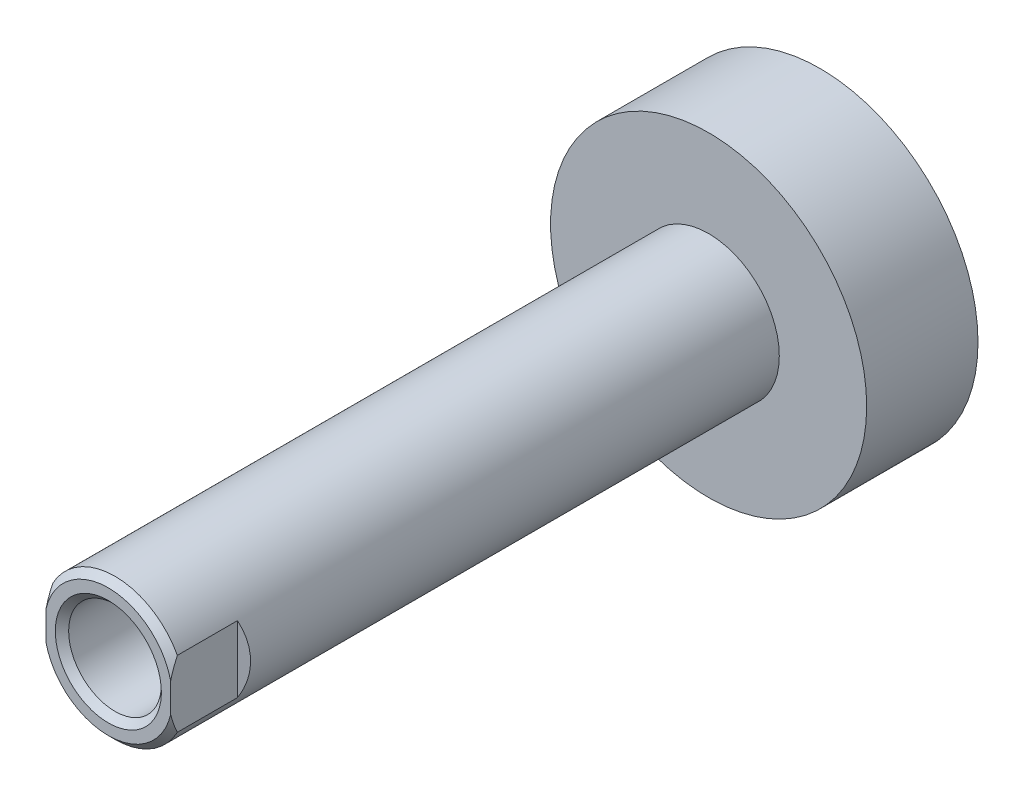
ISO-10303-21;
HEADER;
FILE_DESCRIPTION(('STEP AP214'),'2;1');
FILE_NAME('part.step','',(''),(''),'','','');
FILE_SCHEMA(('AUTOMOTIVE_DESIGN { 1 0 10303 214 1 1 1 1 }'));
ENDSEC;
DATA;
#1=APPLICATION_CONTEXT('core data for automotive mechanical design processes');
#2=APPLICATION_PROTOCOL_DEFINITION('international standard','automotive_design',2000,#1);
#3=PRODUCT_CONTEXT('',#1,'mechanical');
#4=PRODUCT('Part','Part','',(#3));
#5=PRODUCT_RELATED_PRODUCT_CATEGORY('part','',(#4));
#6=PRODUCT_DEFINITION_FORMATION('','',#4);
#7=PRODUCT_DEFINITION_CONTEXT('part definition',#1,'design');
#8=PRODUCT_DEFINITION('design','',#6,#7);
#9=PRODUCT_DEFINITION_SHAPE('','',#8);
#10=(LENGTH_UNIT() NAMED_UNIT(*) SI_UNIT(.MILLI.,.METRE.));
#11=(NAMED_UNIT(*) PLANE_ANGLE_UNIT() SI_UNIT($,.RADIAN.));
#12=(NAMED_UNIT(*) SI_UNIT($,.STERADIAN.) SOLID_ANGLE_UNIT());
#13=UNCERTAINTY_MEASURE_WITH_UNIT(LENGTH_MEASURE(1.E-05),#10,'distance_accuracy_value','');
#14=(GEOMETRIC_REPRESENTATION_CONTEXT(3) GLOBAL_UNCERTAINTY_ASSIGNED_CONTEXT((#13)) GLOBAL_UNIT_ASSIGNED_CONTEXT((#10,
#11,#12)) REPRESENTATION_CONTEXT('',''));
#15=CARTESIAN_POINT('',(0.,0.,0.));
#16=DIRECTION('',(0.,0.,1.));
#17=DIRECTION('',(1.,0.,0.));
#18=AXIS2_PLACEMENT_3D('',#15,#16,#17);
#19=CARTESIAN_POINT('',(0.,0.,31.964));
#20=DIRECTION('',(0.,0.,-1.));
#21=DIRECTION('',(-1.,0.,0.));
#22=AXIS2_PLACEMENT_3D('',#19,#20,#21);
#23=CONICAL_SURFACE('',#22,2.875,0.785398163397448);
#24=CARTESIAN_POINT('',(2.8,6.40409288585039,27.8495504014551));
#25=CARTESIAN_POINT('',(2.8,6.21530131402021,28.0224791142946));
#26=CARTESIAN_POINT('',(2.8,6.02594277949216,28.1947983655281));
#27=CARTESIAN_POINT('',(2.8,5.64560917698831,28.5377342817093));
#28=CARTESIAN_POINT('',(2.8,5.45463373183104,28.7083505279696));
#29=CARTESIAN_POINT('',(2.8,5.0693993005037,29.048438486706));
#30=CARTESIAN_POINT('',(2.8,4.87512693210801,29.2178950791546));
#31=CARTESIAN_POINT('',(2.8,4.48388823614274,29.5536313887583));
#32=CARTESIAN_POINT('',(2.8,4.28692225071637,29.7199115030752));
#33=CARTESIAN_POINT('',(2.8,3.92252866507082,30.020547193242));
#34=CARTESIAN_POINT('',(2.8,3.75567079567851,30.1555906179416));
#35=CARTESIAN_POINT('',(2.8,3.41848834775858,30.4213896916908));
#36=CARTESIAN_POINT('',(2.8,3.24816284560577,30.5521441734836));
#37=CARTESIAN_POINT('',(2.8,2.90310026082266,30.8073200193591));
#38=CARTESIAN_POINT('',(2.8,2.72836898816859,30.9317491319853));
#39=CARTESIAN_POINT('',(2.8,2.4615936005942,31.1113775075954));
#40=CARTESIAN_POINT('',(2.8,2.37190693686159,31.1700734947239));
#41=CARTESIAN_POINT('',(2.8,2.19069178803806,31.2845403791412));
#42=CARTESIAN_POINT('',(2.8,2.09916353869149,31.3403116475729));
#43=CARTESIAN_POINT('',(2.8,1.91535619256875,31.4473786837928));
#44=CARTESIAN_POINT('',(2.8,1.82310918445457,31.4987292209963));
#45=CARTESIAN_POINT('',(2.8,1.63626007281443,31.5969280610082));
#46=CARTESIAN_POINT('',(2.8,1.54165859274648,31.6437775400462));
#47=CARTESIAN_POINT('',(2.8,1.3499249148038,31.7317423789926));
#48=CARTESIAN_POINT('',(2.8,1.25279557260696,31.7728639021425));
#49=CARTESIAN_POINT('',(2.8,1.05579132027356,31.847944220849));
#50=CARTESIAN_POINT('',(2.8,0.955917202290766,31.8819050589735));
#51=CARTESIAN_POINT('',(2.8,0.774015610001952,31.9350128160452));
#52=CARTESIAN_POINT('',(2.8,0.692459969683759,31.955766485837));
#53=CARTESIAN_POINT('',(2.8,0.527974791108692,31.9907885828827));
#54=CARTESIAN_POINT('',(2.8,0.445045717822624,32.0050591602577));
#55=CARTESIAN_POINT('',(2.8,0.278459436251544,32.0263967953165));
#56=CARTESIAN_POINT('',(2.8,0.194804513514812,32.0334814400774));
#57=CARTESIAN_POINT('',(2.8,0.0271926983588117,32.0401200407255));
#58=CARTESIAN_POINT('',(2.8,-0.0567641889013517,32.039674124668));
#59=CARTESIAN_POINT('',(2.8,-0.224256787385993,32.0312791669753));
#60=CARTESIAN_POINT('',(2.8,-0.307792675605983,32.0233335991373));
#61=CARTESIAN_POINT('',(2.8,-0.473890294720242,32.0003734951748));
#62=CARTESIAN_POINT('',(2.8,-0.556451813717606,31.9853574494422));
#63=CARTESIAN_POINT('',(2.8,-0.720378465833255,31.9489246360367));
#64=CARTESIAN_POINT('',(2.8,-0.801739522303185,31.927489762131));
#65=CARTESIAN_POINT('',(2.8,-0.962778849550983,31.8790943027323));
#66=CARTESIAN_POINT('',(2.8,-1.04245714605219,31.8521338017738));
#67=CARTESIAN_POINT('',(2.8,-1.21987368113352,31.7861807538754));
#68=CARTESIAN_POINT('',(2.8,-1.31711815376234,31.7458671833215));
#69=CARTESIAN_POINT('',(2.8,-1.50900170685828,31.6594178174973));
#70=CARTESIAN_POINT('',(2.8,-1.6036395501869,31.6132793137298));
#71=CARTESIAN_POINT('',(2.8,-1.79068294250203,31.5163296497851));
#72=CARTESIAN_POINT('',(2.8,-1.88308428843925,31.4655104419594));
#73=CARTESIAN_POINT('',(2.8,-2.06579163515272,31.3602183243824));
#74=CARTESIAN_POINT('',(2.8,-2.15609721381246,31.3057446870287));
#75=CARTESIAN_POINT('',(2.8,-2.33581888189106,31.1933062497769));
#76=CARTESIAN_POINT('',(2.8,-2.4252157445204,31.1353108566371));
#77=CARTESIAN_POINT('',(2.8,-2.60241554860158,31.0169282900505));
#78=CARTESIAN_POINT('',(2.8,-2.69021835064665,30.9565409088705));
#79=CARTESIAN_POINT('',(2.8,-2.95163931230509,30.7724562849016));
#80=CARTESIAN_POINT('',(2.8,-3.1232209180828,30.6458679924581));
#81=CARTESIAN_POINT('',(2.8,-3.43143863596192,30.4110457530675));
#82=CARTESIAN_POINT('',(2.8,-3.5687407975733,30.3036750622679));
#83=CARTESIAN_POINT('',(2.8,-3.84120420423013,30.0863065843494));
#84=CARTESIAN_POINT('',(2.8,-3.97636586386933,29.9763093165843));
#85=CARTESIAN_POINT('',(2.8,-4.24509543339167,29.7542072896423));
#86=CARTESIAN_POINT('',(2.8,-4.3786621976108,29.6421011488779));
#87=CARTESIAN_POINT('',(2.8,-4.64443688882979,29.4162794076186));
#88=CARTESIAN_POINT('',(2.8,-4.77664474964281,29.3025637293647));
#89=CARTESIAN_POINT('',(2.8,-5.16103062136353,28.9686969018967));
#90=CARTESIAN_POINT('',(2.8,-5.41172447055858,28.7468373546205));
#91=CARTESIAN_POINT('',(2.8,-5.78548758602014,28.4118019699764));
#92=CARTESIAN_POINT('',(2.8,-5.90962703562807,28.2998122892259));
#93=CARTESIAN_POINT('',(2.8,-6.15729395528682,28.0751586496859));
#94=CARTESIAN_POINT('',(2.8,-6.28082142680382,27.9624946925134));
#95=CARTESIAN_POINT('',(2.8,-6.40409288585039,27.8495504014551));
#96=B_SPLINE_CURVE_WITH_KNOTS('',3,(#24,#25,#26,#27,#28,#29,#30,#31,#32,#33,#34,#35,#36,#37,#38,
#39,#40,#41,#42,#43,#44,#45,#46,#47,#48,#49,#50,#51,#52,#53,#54,#55,#56,#57,#58,#59,#60,#61,#62,
#63,#64,#65,#66,#67,#68,#69,#70,#71,#72,#73,#74,#75,#76,#77,#78,#79,#80,#81,#82,#83,#84,#85,#86,
#87,#88,#89,#90,#91,#92,#93,#94,#95),.UNSPECIFIED.,.F.,.F.,(4,2,2,2,2,2,2,2,2,2,2,2,2,2,2,2,2,2,
2,2,2,2,2,2,2,2,2,2,2,2,2,2,2,2,2,4),(0.,0.7680704659828,1.5363253295418,2.3096809370453,
3.0829392088611,3.72686189949447,4.37095840685427,5.01424588420806,5.33576238949959,
5.65723799555328,5.973870166396,6.29041936764635,6.60662528866311,6.92274089032019,
7.17497877598579,7.4271329456448,7.67866848525016,7.93019974755984,8.1816145591257,
8.43308307428408,8.68526772293322,8.93744851379238,9.25300704333973,9.56871284654273,
9.88497196065972,10.2012942304021,10.5209300388869,10.840593667401,11.4800956660014,
12.0029633797013,12.5257285490225,13.0488490267357,13.571994863987,14.5762479594562,
15.0778149878801,15.5793808140611),.UNSPECIFIED.);
#97=CARTESIAN_POINT('',(2.8,1.49687173799227,31.664));
#98=VERTEX_POINT('',#97);
#99=CARTESIAN_POINT('',(2.8,0.652399417534977,31.964));
#100=VERTEX_POINT('',#99);
#101=EDGE_CURVE('E43',#98,#100,#96,.T.);
#102=ORIENTED_EDGE('',*,*,#101,.F.);
#103=CARTESIAN_POINT('',(0.,0.,31.664));
#104=DIRECTION('',(0.,0.,-1.));
#105=DIRECTION('',(-1.,0.,0.));
#106=AXIS2_PLACEMENT_3D('',#103,#104,#105);
#107=CIRCLE('',#106,3.175);
#108=CARTESIAN_POINT('',(-2.8,1.49687173799227,31.664));
#109=VERTEX_POINT('',#108);
#110=EDGE_CURVE('E115',#109,#98,#107,.T.);
#111=ORIENTED_EDGE('',*,*,#110,.F.);
#112=CARTESIAN_POINT('',(-2.8,-6.40409288585039,27.8495504014551));
#113=CARTESIAN_POINT('',(-2.8,-6.21530131402021,28.0224791142946));
#114=CARTESIAN_POINT('',(-2.8,-6.02594277949216,28.1947983655281));
#115=CARTESIAN_POINT('',(-2.8,-5.64560917698831,28.5377342817093));
#116=CARTESIAN_POINT('',(-2.8,-5.45463373183104,28.7083505279696));
#117=CARTESIAN_POINT('',(-2.8,-5.0693993005037,29.048438486706));
#118=CARTESIAN_POINT('',(-2.8,-4.87512693210801,29.2178950791546));
#119=CARTESIAN_POINT('',(-2.8,-4.48388823614274,29.5536313887583));
#120=CARTESIAN_POINT('',(-2.8,-4.28692225071637,29.7199115030752));
#121=CARTESIAN_POINT('',(-2.8,-3.92252866507082,30.020547193242));
#122=CARTESIAN_POINT('',(-2.8,-3.7556707956785,30.1555906179416));
#123=CARTESIAN_POINT('',(-2.8,-3.41848834775856,30.4213896916909));
#124=CARTESIAN_POINT('',(-2.8,-3.24816284560575,30.5521441734836));
#125=CARTESIAN_POINT('',(-2.8,-2.90310026082264,30.8073200193591));
#126=CARTESIAN_POINT('',(-2.8,-2.72836898816857,30.9317491319853));
#127=CARTESIAN_POINT('',(-2.8,-2.46159360059418,31.1113775075954));
#128=CARTESIAN_POINT('',(-2.8,-2.37190693686156,31.1700734947239));
#129=CARTESIAN_POINT('',(-2.8,-2.19069178803803,31.2845403791412));
#130=CARTESIAN_POINT('',(-2.8,-2.09916353869147,31.3403116475729));
#131=CARTESIAN_POINT('',(-2.8,-1.91535619256872,31.4473786837929));
#132=CARTESIAN_POINT('',(-2.8,-1.82310918445454,31.4987292209963));
#133=CARTESIAN_POINT('',(-2.8,-1.6362600728144,31.5969280610082));
#134=CARTESIAN_POINT('',(-2.8,-1.54165859274646,31.6437775400462));
#135=CARTESIAN_POINT('',(-2.8,-1.34992491480378,31.7317423789926));
#136=CARTESIAN_POINT('',(-2.8,-1.25279557260694,31.7728639021425));
#137=CARTESIAN_POINT('',(-2.8,-1.05579132027353,31.847944220849));
#138=CARTESIAN_POINT('',(-2.8,-0.955917202290747,31.8819050589736));
#139=CARTESIAN_POINT('',(-2.8,-0.774015610001933,31.9350128160452));
#140=CARTESIAN_POINT('',(-2.8,-0.692459969683738,31.955766485837));
#141=CARTESIAN_POINT('',(-2.8,-0.527974791108672,31.9907885828827));
#142=CARTESIAN_POINT('',(-2.8,-0.445045717822605,32.0050591602577));
#143=CARTESIAN_POINT('',(-2.8,-0.278459436251525,32.0263967953165));
#144=CARTESIAN_POINT('',(-2.8,-0.194804513514793,32.0334814400774));
#145=CARTESIAN_POINT('',(-2.8,-0.0271926983587928,32.0401200407255));
#146=CARTESIAN_POINT('',(-2.8,0.05676418890137,32.039674124668));
#147=CARTESIAN_POINT('',(-2.8,0.224256787386008,32.0312791669753));
#148=CARTESIAN_POINT('',(-2.8,0.307792675605997,32.0233335991373));
#149=CARTESIAN_POINT('',(-2.8,0.473890294720254,32.0003734951748));
#150=CARTESIAN_POINT('',(-2.8,0.556451813717619,31.9853574494422));
#151=CARTESIAN_POINT('',(-2.8,0.720378465833267,31.9489246360367));
#152=CARTESIAN_POINT('',(-2.8,0.801739522303197,31.927489762131));
#153=CARTESIAN_POINT('',(-2.8,0.962778849550994,31.8790943027323));
#154=CARTESIAN_POINT('',(-2.8,1.04245714605221,31.8521338017738));
#155=CARTESIAN_POINT('',(-2.8,1.21987368113353,31.7861807538754));
#156=CARTESIAN_POINT('',(-2.8,1.31711815376235,31.7458671833215));
#157=CARTESIAN_POINT('',(-2.8,1.50900170685829,31.6594178174973));
#158=CARTESIAN_POINT('',(-2.8,1.60363955018691,31.6132793137298));
#159=CARTESIAN_POINT('',(-2.8,1.79068294250205,31.5163296497851));
#160=CARTESIAN_POINT('',(-2.8,1.88308428843927,31.4655104419594));
#161=CARTESIAN_POINT('',(-2.8,2.06579163515274,31.3602183243824));
#162=CARTESIAN_POINT('',(-2.8,2.15609721381248,31.3057446870287));
#163=CARTESIAN_POINT('',(-2.8,2.33581888189108,31.1933062497768));
#164=CARTESIAN_POINT('',(-2.8,2.42521574452043,31.1353108566371));
#165=CARTESIAN_POINT('',(-2.8,2.60241554860161,31.0169282900505));
#166=CARTESIAN_POINT('',(-2.8,2.69021835064668,30.9565409088705));
#167=CARTESIAN_POINT('',(-2.8,2.95163931230512,30.7724562849015));
#168=CARTESIAN_POINT('',(-2.8,3.12322091808284,30.6458679924581));
#169=CARTESIAN_POINT('',(-2.8,3.43143863596195,30.4110457530675));
#170=CARTESIAN_POINT('',(-2.8,3.56874079757333,30.3036750622679));
#171=CARTESIAN_POINT('',(-2.8,3.84120420423016,30.0863065843494));
#172=CARTESIAN_POINT('',(-2.8,3.97636586386936,29.9763093165843));
#173=CARTESIAN_POINT('',(-2.8,4.24509543339169,29.7542072896423));
#174=CARTESIAN_POINT('',(-2.8,4.37866219761082,29.6421011488778));
#175=CARTESIAN_POINT('',(-2.8,4.64443688882981,29.4162794076185));
#176=CARTESIAN_POINT('',(-2.8,4.77664474964283,29.3025637293647));
#177=CARTESIAN_POINT('',(-2.8,5.16103062136354,28.9686969018967));
#178=CARTESIAN_POINT('',(-2.8,5.41172447055859,28.7468373546205));
#179=CARTESIAN_POINT('',(-2.8,5.78548758602014,28.4118019699764));
#180=CARTESIAN_POINT('',(-2.8,5.90962703562808,28.2998122892259));
#181=CARTESIAN_POINT('',(-2.8,6.15729395528682,28.0751586496859));
#182=CARTESIAN_POINT('',(-2.8,6.28082142680383,27.9624946925134));
#183=CARTESIAN_POINT('',(-2.8,6.40409288585039,27.8495504014551));
#184=B_SPLINE_CURVE_WITH_KNOTS('',3,(#112,#113,#114,#115,#116,#117,#118,#119,#120,#121,#122,
#123,#124,#125,#126,#127,#128,#129,#130,#131,#132,#133,#134,#135,#136,#137,#138,#139,#140,#141,
#142,#143,#144,#145,#146,#147,#148,#149,#150,#151,#152,#153,#154,#155,#156,#157,#158,#159,#160,
#161,#162,#163,#164,#165,#166,#167,#168,#169,#170,#171,#172,#173,#174,#175,#176,#177,#178,#179,
#180,#181,#182,#183),.UNSPECIFIED.,.F.,.F.,(4,2,2,2,2,2,2,2,2,2,2,2,2,2,2,2,2,2,2,2,2,2,2,2,2,2,
2,2,2,2,2,2,2,2,2,4),(0.,0.768070465982802,1.5363253295418,2.3096809370453,3.08293920886111,
3.72686189949449,4.37095840685429,5.0142458842081,5.33576238949962,5.65723799555331,
5.97387016639603,6.29041936764638,6.60662528866313,6.92274089032021,7.17497877598581,
7.42713294564482,7.67866848525018,7.93019974755985,8.18161455912571,8.43308307428409,
8.68526772293323,8.93744851379239,9.25300704333975,9.56871284654274,9.88497196065973,
10.2012942304021,10.5209300388869,10.840593667401,11.4800956660014,12.0029633797013,
12.5257285490226,13.0488490267358,13.571994863987,14.5762479594562,15.0778149878801,
15.5793808140611),.UNSPECIFIED.);
#185=CARTESIAN_POINT('',(-2.8,0.652399417534992,31.964));
#186=VERTEX_POINT('',#185);
#187=EDGE_CURVE('E106',#186,#109,#184,.T.);
#188=ORIENTED_EDGE('',*,*,#187,.F.);
#189=CARTESIAN_POINT('',(0.,0.,31.964));
#190=DIRECTION('',(0.,0.,-1.));
#191=DIRECTION('',(0.,1.,0.));
#192=AXIS2_PLACEMENT_3D('',#189,#190,#191);
#193=CIRCLE('',#192,2.875);
#194=EDGE_CURVE('E57',#100,#186,#193,.F.);
#195=ORIENTED_EDGE('',*,*,#194,.F.);
#196=EDGE_LOOP('',(#102,#111,#188,#195));
#197=FACE_BOUND('',#196,.T.);
#198=ADVANCED_FACE('F35',(#197),#23,.T.);
#199=CARTESIAN_POINT('',(0.,0.,5.));
#200=DIRECTION('',(0.,0.,-1.));
#201=DIRECTION('',(-1.,0.,0.));
#202=AXIS2_PLACEMENT_3D('',#199,#200,#201);
#203=CYLINDRICAL_SURFACE('',#202,7.1);
#204=CARTESIAN_POINT('',(0.,0.,5.));
#205=DIRECTION('',(0.,0.,1.));
#206=DIRECTION('',(1.,0.,0.));
#207=AXIS2_PLACEMENT_3D('',#204,#205,#206);
#208=CIRCLE('',#207,7.1);
#209=CARTESIAN_POINT('',(7.1,0.,5.));
#210=VERTEX_POINT('',#209);
#211=EDGE_CURVE('E180',#210,#210,#208,.T.);
#212=ORIENTED_EDGE('',*,*,#211,.F.);
#213=EDGE_LOOP('',(#212));
#214=FACE_BOUND('',#213,.T.);
#215=CARTESIAN_POINT('',(0.,0.,0.));
#216=DIRECTION('',(0.,0.,1.));
#217=DIRECTION('',(1.,0.,0.));
#218=AXIS2_PLACEMENT_3D('',#215,#216,#217);
#219=CIRCLE('',#218,7.1);
#220=CARTESIAN_POINT('',(7.1,0.,0.));
#221=VERTEX_POINT('',#220);
#222=EDGE_CURVE('E183',#221,#221,#219,.T.);
#223=ORIENTED_EDGE('',*,*,#222,.T.);
#224=EDGE_LOOP('',(#223));
#225=FACE_BOUND('',#224,.T.);
#226=ADVANCED_FACE('F168',(#214,#225),#203,.T.);
#227=CARTESIAN_POINT('',(0.,0.,5.));
#228=DIRECTION('',(0.,0.,1.));
#229=DIRECTION('',(1.,0.,0.));
#230=AXIS2_PLACEMENT_3D('',#227,#228,#229);
#231=PLANE('',#230);
#232=CARTESIAN_POINT('',(0.,0.,5.));
#233=DIRECTION('',(0.,0.,1.));
#234=DIRECTION('',(1.,0.,0.));
#235=AXIS2_PLACEMENT_3D('',#232,#233,#234);
#236=CIRCLE('',#235,3.175);
#237=CARTESIAN_POINT('',(3.175,0.,5.));
#238=VERTEX_POINT('',#237);
#239=EDGE_CURVE('E111',#238,#238,#236,.T.);
#240=ORIENTED_EDGE('',*,*,#239,.F.);
#241=EDGE_LOOP('',(#240));
#242=FACE_BOUND('',#241,.T.);
#243=ORIENTED_EDGE('',*,*,#211,.T.);
#244=EDGE_LOOP('',(#243));
#245=FACE_BOUND('',#244,.T.);
#246=ADVANCED_FACE('F165',(#242,#245),#231,.T.);
#247=CARTESIAN_POINT('',(0.,0.,0.));
#248=DIRECTION('',(0.,0.,1.));
#249=DIRECTION('',(1.,0.,0.));
#250=AXIS2_PLACEMENT_3D('',#247,#248,#249);
#251=PLANE('',#250);
#252=ORIENTED_EDGE('',*,*,#222,.F.);
#253=EDGE_LOOP('',(#252));
#254=FACE_BOUND('',#253,.T.);
#255=ADVANCED_FACE('F163',(#254),#251,.F.);
#256=CARTESIAN_POINT('',(0.,0.,40.9442561210692));
#257=DIRECTION('',(0.,0.,-1.));
#258=DIRECTION('',(-1.,0.,0.));
#259=AXIS2_PLACEMENT_3D('',#256,#257,#258);
#260=CYLINDRICAL_SURFACE('',#259,3.175);
#261=DIRECTION('',(0.,0.,-1.));
#262=VECTOR('',#261,1.);
#263=CARTESIAN_POINT('',(2.8,1.49687173799227,40.9442561210692));
#264=LINE('',#263,#262);
#265=CARTESIAN_POINT('',(2.8,1.49687173799227,28.964));
#266=VERTEX_POINT('',#265);
#267=EDGE_CURVE('E92',#266,#98,#264,.F.);
#268=ORIENTED_EDGE('',*,*,#267,.F.);
#269=CARTESIAN_POINT('',(0.,0.,30.580580753731));
#270=DIRECTION('',(-0.500000000000004,0.,-0.866025403784436));
#271=DIRECTION('',(0.866025403784436,0.,-0.500000000000004));
#272=AXIS2_PLACEMENT_3D('',#269,#270,#271);
#273=ELLIPSE('',#272,3.66617420935414,3.175);
#274=CARTESIAN_POINT('',(2.8,-1.49687173799227,28.964));
#275=VERTEX_POINT('',#274);
#276=EDGE_CURVE('E12',#275,#266,#273,.F.);
#277=ORIENTED_EDGE('',*,*,#276,.F.);
#278=DIRECTION('',(0.,0.,-1.));
#279=VECTOR('',#278,1.);
#280=CARTESIAN_POINT('',(2.8,-1.49687173799227,40.9442561210692));
#281=LINE('',#280,#279);
#282=CARTESIAN_POINT('',(2.8,-1.49687173799227,31.664));
#283=VERTEX_POINT('',#282);
#284=EDGE_CURVE('E102',#283,#275,#281,.T.);
#285=ORIENTED_EDGE('',*,*,#284,.F.);
#286=CARTESIAN_POINT('',(-2.8,-1.49687173799227,31.664));
#287=VERTEX_POINT('',#286);
#288=EDGE_CURVE('E109',#283,#287,#107,.T.);
#289=ORIENTED_EDGE('',*,*,#288,.T.);
#290=DIRECTION('',(0.,0.,-1.));
#291=VECTOR('',#290,1.);
#292=CARTESIAN_POINT('',(-2.8,-1.49687173799227,40.9442561210692));
#293=LINE('',#292,#291);
#294=CARTESIAN_POINT('',(-2.8,-1.49687173799227,28.964));
#295=VERTEX_POINT('',#294);
#296=EDGE_CURVE('E197',#295,#287,#293,.F.);
#297=ORIENTED_EDGE('',*,*,#296,.F.);
#298=CARTESIAN_POINT('',(0.,0.,30.580580753731));
#299=DIRECTION('',(0.500000000000004,0.,-0.866025403784437));
#300=DIRECTION('',(-0.866025403784437,0.,-0.500000000000004));
#301=AXIS2_PLACEMENT_3D('',#298,#299,#300);
#302=ELLIPSE('',#301,3.66617420935413,3.175);
#303=CARTESIAN_POINT('',(-2.8,1.49687173799227,28.964));
#304=VERTEX_POINT('',#303);
#305=EDGE_CURVE('E126',#304,#295,#302,.F.);
#306=ORIENTED_EDGE('',*,*,#305,.F.);
#307=DIRECTION('',(0.,0.,-1.));
#308=VECTOR('',#307,1.);
#309=CARTESIAN_POINT('',(-2.8,1.49687173799227,40.9442561210692));
#310=LINE('',#309,#308);
#311=EDGE_CURVE('E200',#109,#304,#310,.T.);
#312=ORIENTED_EDGE('',*,*,#311,.F.);
#313=ORIENTED_EDGE('',*,*,#110,.T.);
#314=EDGE_LOOP('',(#268,#277,#285,#289,#297,#306,#312,#313));
#315=FACE_BOUND('',#314,.T.);
#316=ORIENTED_EDGE('',*,*,#239,.T.);
#317=EDGE_LOOP('',(#316));
#318=FACE_BOUND('',#317,.T.);
#319=ADVANCED_FACE('F160',(#315,#318),#260,.T.);
#320=CARTESIAN_POINT('',(0.,0.,31.964));
#321=DIRECTION('',(0.,0.,-1.));
#322=DIRECTION('',(0.,1.,0.));
#323=AXIS2_PLACEMENT_3D('',#320,#321,#322);
#324=PLANE('',#323);
#325=CARTESIAN_POINT('',(-2.8,-0.652399417534992,31.964));
#326=VERTEX_POINT('',#325);
#327=CARTESIAN_POINT('',(2.8,-0.65239941753498,31.964));
#328=VERTEX_POINT('',#327);
#329=EDGE_CURVE('E101',#326,#328,#193,.F.);
#330=ORIENTED_EDGE('',*,*,#329,.T.);
#331=DIRECTION('',(0.,1.,0.));
#332=VECTOR('',#331,1.);
#333=CARTESIAN_POINT('',(2.8,-7.1,31.964));
#334=LINE('',#333,#332);
#335=EDGE_CURVE('E50',#328,#100,#334,.T.);
#336=ORIENTED_EDGE('',*,*,#335,.T.);
#337=ORIENTED_EDGE('',*,*,#194,.T.);
#338=DIRECTION('',(0.,1.,0.));
#339=VECTOR('',#338,1.);
#340=CARTESIAN_POINT('',(-2.8,-7.1,31.964));
#341=LINE('',#340,#339);
#342=EDGE_CURVE('E203',#326,#186,#341,.T.);
#343=ORIENTED_EDGE('',*,*,#342,.F.);
#344=EDGE_LOOP('',(#330,#336,#337,#343));
#345=FACE_BOUND('',#344,.T.);
#346=CARTESIAN_POINT('',(0.,0.,31.964));
#347=DIRECTION('',(0.,0.,-1.));
#348=DIRECTION('',(0.,1.,0.));
#349=AXIS2_PLACEMENT_3D('',#346,#347,#348);
#350=CIRCLE('',#349,2.3828);
#351=CARTESIAN_POINT('',(0.,2.3828,31.964));
#352=VERTEX_POINT('',#351);
#353=EDGE_CURVE('E107',#352,#352,#350,.T.);
#354=ORIENTED_EDGE('',*,*,#353,.T.);
#355=EDGE_LOOP('',(#354));
#356=FACE_BOUND('',#355,.T.);
#357=ADVANCED_FACE('F98',(#345,#356),#324,.F.);
#358=CARTESIAN_POINT('',(0.,0.,31.964));
#359=DIRECTION('',(0.,0.,1.));
#360=DIRECTION('',(0.,-1.,0.));
#361=AXIS2_PLACEMENT_3D('',#358,#359,#360);
#362=CYLINDRICAL_SURFACE('',#361,2.0828);
#363=CARTESIAN_POINT('',(0.,0.,31.664));
#364=DIRECTION('',(0.,0.,-1.));
#365=DIRECTION('',(0.,1.,0.));
#366=AXIS2_PLACEMENT_3D('',#363,#364,#365);
#367=CIRCLE('',#366,2.0828);
#368=CARTESIAN_POINT('',(0.,2.0828,31.664));
#369=VERTEX_POINT('',#368);
#370=EDGE_CURVE('E117',#369,#369,#367,.F.);
#371=ORIENTED_EDGE('',*,*,#370,.T.);
#372=EDGE_LOOP('',(#371));
#373=FACE_BOUND('',#372,.T.);
#374=CARTESIAN_POINT('',(0.,0.,20.28));
#375=DIRECTION('',(0.,0.,1.));
#376=DIRECTION('',(0.,-1.,0.));
#377=AXIS2_PLACEMENT_3D('',#374,#375,#376);
#378=CIRCLE('',#377,2.0828);
#379=CARTESIAN_POINT('',(0.,-2.0828,20.28));
#380=VERTEX_POINT('',#379);
#381=EDGE_CURVE('E184',#380,#380,#378,.T.);
#382=ORIENTED_EDGE('',*,*,#381,.F.);
#383=EDGE_LOOP('',(#382));
#384=FACE_BOUND('',#383,.T.);
#385=ADVANCED_FACE('F153',(#373,#384),#362,.F.);
#386=CARTESIAN_POINT('',(1.7272,0.,20.28));
#387=DIRECTION('',(0.,0.,-1.));
#388=DIRECTION('',(0.,1.,0.));
#389=AXIS2_PLACEMENT_3D('',#386,#387,#388);
#390=PLANE('',#389);
#391=CARTESIAN_POINT('',(0.,0.,20.28));
#392=DIRECTION('',(0.,0.,1.));
#393=DIRECTION('',(0.,-1.,0.));
#394=AXIS2_PLACEMENT_3D('',#391,#392,#393);
#395=CIRCLE('',#394,1.7272);
#396=CARTESIAN_POINT('',(0.,-1.7272,20.28));
#397=VERTEX_POINT('',#396);
#398=EDGE_CURVE('E187',#397,#397,#395,.T.);
#399=ORIENTED_EDGE('',*,*,#398,.F.);
#400=EDGE_LOOP('',(#399));
#401=FACE_BOUND('',#400,.T.);
#402=ORIENTED_EDGE('',*,*,#381,.T.);
#403=EDGE_LOOP('',(#402));
#404=FACE_BOUND('',#403,.T.);
#405=ADVANCED_FACE('F149',(#401,#404),#390,.F.);
#406=CARTESIAN_POINT('',(0.,0.,31.964));
#407=DIRECTION('',(0.,0.,1.));
#408=DIRECTION('',(0.,-1.,0.));
#409=AXIS2_PLACEMENT_3D('',#406,#407,#408);
#410=CYLINDRICAL_SURFACE('',#409,1.7272);
#411=CARTESIAN_POINT('',(0.,0.,17.88656));
#412=DIRECTION('',(0.,0.,1.));
#413=DIRECTION('',(0.,-1.,0.));
#414=AXIS2_PLACEMENT_3D('',#411,#412,#413);
#415=CIRCLE('',#414,1.7272);
#416=CARTESIAN_POINT('',(0.,-1.7272,17.88656));
#417=VERTEX_POINT('',#416);
#418=EDGE_CURVE('E194',#417,#417,#415,.T.);
#419=ORIENTED_EDGE('',*,*,#418,.F.);
#420=EDGE_LOOP('',(#419));
#421=FACE_BOUND('',#420,.T.);
#422=ORIENTED_EDGE('',*,*,#398,.T.);
#423=EDGE_LOOP('',(#422));
#424=FACE_BOUND('',#423,.T.);
#425=ADVANCED_FACE('F145',(#421,#424),#410,.F.);
#426=CARTESIAN_POINT('',(0.,0.,17.88656));
#427=DIRECTION('',(0.,0.,1.));
#428=DIRECTION('',(0.,-1.,0.));
#429=AXIS2_PLACEMENT_3D('',#426,#427,#428);
#430=CONICAL_SURFACE('',#429,1.7272,1.02974425867665);
#431=CARTESIAN_POINT('',(0.,0.,16.8487535388156));
#432=VERTEX_POINT('',#431);
#433=VERTEX_LOOP('',#432);
#434=FACE_BOUND('',#433,.T.);
#435=ORIENTED_EDGE('',*,*,#418,.T.);
#436=EDGE_LOOP('',(#435));
#437=FACE_BOUND('',#436,.T.);
#438=ADVANCED_FACE('F142',(#434,#437),#430,.F.);
#439=EDGE_CURVE('E96',#328,#283,#96,.T.);
#440=ORIENTED_EDGE('',*,*,#439,.F.);
#441=ORIENTED_EDGE('',*,*,#329,.F.);
#442=EDGE_CURVE('E125',#287,#326,#184,.T.);
#443=ORIENTED_EDGE('',*,*,#442,.F.);
#444=ORIENTED_EDGE('',*,*,#288,.F.);
#445=EDGE_LOOP('',(#440,#441,#443,#444));
#446=FACE_BOUND('',#445,.T.);
#447=ADVANCED_FACE('F127',(#446),#23,.T.);
#448=CARTESIAN_POINT('',(0.,0.,31.664));
#449=DIRECTION('',(0.,0.,1.));
#450=DIRECTION('',(0.,-1.,0.));
#451=AXIS2_PLACEMENT_3D('',#448,#449,#450);
#452=CONICAL_SURFACE('',#451,2.0828,0.785398163397444);
#453=ORIENTED_EDGE('',*,*,#353,.F.);
#454=EDGE_LOOP('',(#453));
#455=FACE_BOUND('',#454,.T.);
#456=ORIENTED_EDGE('',*,*,#370,.F.);
#457=EDGE_LOOP('',(#456));
#458=FACE_BOUND('',#457,.T.);
#459=ADVANCED_FACE('F37',(#455,#458),#452,.F.);
#460=CARTESIAN_POINT('',(-2.8,-7.1,28.964));
#461=DIRECTION('',(0.500000000000004,0.,-0.866025403784437));
#462=DIRECTION('',(-0.866025403784437,0.,-0.500000000000004));
#463=AXIS2_PLACEMENT_3D('',#460,#461,#462);
#464=PLANE('',#463);
#465=ORIENTED_EDGE('',*,*,#305,.T.);
#466=DIRECTION('',(0.,1.,0.));
#467=VECTOR('',#466,1.);
#468=CARTESIAN_POINT('',(-2.8,-7.1,28.964));
#469=LINE('',#468,#467);
#470=EDGE_CURVE('E202',#295,#304,#469,.T.);
#471=ORIENTED_EDGE('',*,*,#470,.T.);
#472=EDGE_LOOP('',(#465,#471));
#473=FACE_BOUND('',#472,.T.);
#474=ADVANCED_FACE('F136',(#473),#464,.F.);
#475=CARTESIAN_POINT('',(-2.8,-7.1,31.964));
#476=DIRECTION('',(1.,0.,0.));
#477=DIRECTION('',(0.,0.,-1.));
#478=AXIS2_PLACEMENT_3D('',#475,#476,#477);
#479=PLANE('',#478);
#480=ORIENTED_EDGE('',*,*,#296,.T.);
#481=ORIENTED_EDGE('',*,*,#442,.T.);
#482=ORIENTED_EDGE('',*,*,#342,.T.);
#483=ORIENTED_EDGE('',*,*,#187,.T.);
#484=ORIENTED_EDGE('',*,*,#311,.T.);
#485=ORIENTED_EDGE('',*,*,#470,.F.);
#486=EDGE_LOOP('',(#480,#481,#482,#483,#484,#485));
#487=FACE_BOUND('',#486,.T.);
#488=ADVANCED_FACE('F130',(#487),#479,.F.);
#489=CARTESIAN_POINT('',(2.8,-7.1,28.964));
#490=DIRECTION('',(-0.500000000000004,0.,-0.866025403784436));
#491=DIRECTION('',(-0.866025403784436,0.,0.500000000000004));
#492=AXIS2_PLACEMENT_3D('',#489,#490,#491);
#493=PLANE('',#492);
#494=ORIENTED_EDGE('',*,*,#276,.T.);
#495=DIRECTION('',(0.,1.,0.));
#496=VECTOR('',#495,1.);
#497=CARTESIAN_POINT('',(2.8,-7.1,28.964));
#498=LINE('',#497,#496);
#499=EDGE_CURVE('E103',#275,#266,#498,.T.);
#500=ORIENTED_EDGE('',*,*,#499,.F.);
#501=EDGE_LOOP('',(#494,#500));
#502=FACE_BOUND('',#501,.T.);
#503=ADVANCED_FACE('F135',(#502),#493,.F.);
#504=CARTESIAN_POINT('',(2.8,-7.1,31.964));
#505=DIRECTION('',(-1.,0.,0.));
#506=DIRECTION('',(0.,0.,1.));
#507=AXIS2_PLACEMENT_3D('',#504,#505,#506);
#508=PLANE('',#507);
#509=ORIENTED_EDGE('',*,*,#267,.T.);
#510=ORIENTED_EDGE('',*,*,#101,.T.);
#511=ORIENTED_EDGE('',*,*,#335,.F.);
#512=ORIENTED_EDGE('',*,*,#439,.T.);
#513=ORIENTED_EDGE('',*,*,#284,.T.);
#514=ORIENTED_EDGE('',*,*,#499,.T.);
#515=EDGE_LOOP('',(#509,#510,#511,#512,#513,#514));
#516=FACE_BOUND('',#515,.T.);
#517=ADVANCED_FACE('F89',(#516),#508,.F.);
#518=CLOSED_SHELL('',(#198,#226,#246,#255,#319,#357,#385,#405,#425,#438,#447,#459,#474,#488,
#503,#517));
#519=MANIFOLD_SOLID_BREP('B2',#518);
#520=ADVANCED_BREP_SHAPE_REPRESENTATION('',(#18,#519),#14);
#521=SHAPE_DEFINITION_REPRESENTATION(#9,#520);
ENDSEC;
END-ISO-10303-21;
